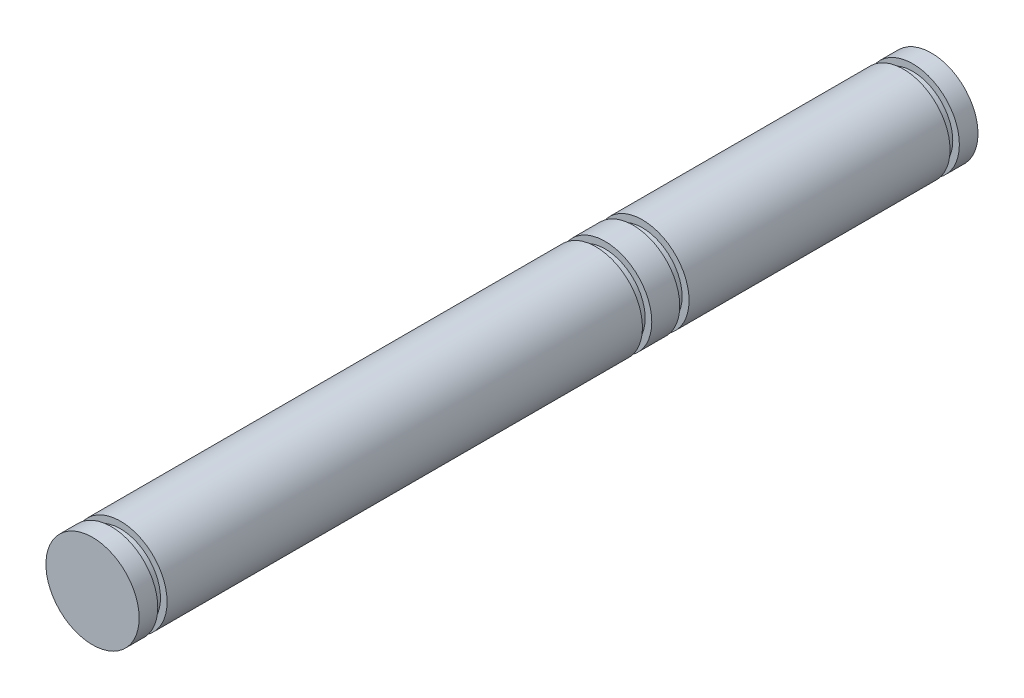
ISO-10303-21;
HEADER;
FILE_DESCRIPTION(('STEP AP214'),'2;1');
FILE_NAME('part.step','',(''),(''),'','','');
FILE_SCHEMA(('AUTOMOTIVE_DESIGN { 1 0 10303 214 1 1 1 1 }'));
ENDSEC;
DATA;
#1=APPLICATION_CONTEXT('core data for automotive mechanical design processes');
#2=APPLICATION_PROTOCOL_DEFINITION('international standard','automotive_design',2000,#1);
#3=PRODUCT_CONTEXT('',#1,'mechanical');
#4=PRODUCT('Part','Part','',(#3));
#5=PRODUCT_RELATED_PRODUCT_CATEGORY('part','',(#4));
#6=PRODUCT_DEFINITION_FORMATION('','',#4);
#7=PRODUCT_DEFINITION_CONTEXT('part definition',#1,'design');
#8=PRODUCT_DEFINITION('design','',#6,#7);
#9=PRODUCT_DEFINITION_SHAPE('','',#8);
#10=(LENGTH_UNIT() NAMED_UNIT(*) SI_UNIT(.MILLI.,.METRE.));
#11=(NAMED_UNIT(*) PLANE_ANGLE_UNIT() SI_UNIT($,.RADIAN.));
#12=(NAMED_UNIT(*) SI_UNIT($,.STERADIAN.) SOLID_ANGLE_UNIT());
#13=UNCERTAINTY_MEASURE_WITH_UNIT(LENGTH_MEASURE(1.E-05),#10,'distance_accuracy_value','');
#14=(GEOMETRIC_REPRESENTATION_CONTEXT(3) GLOBAL_UNCERTAINTY_ASSIGNED_CONTEXT((#13)) GLOBAL_UNIT_ASSIGNED_CONTEXT((#10,
#11,#12)) REPRESENTATION_CONTEXT('',''));
#15=CARTESIAN_POINT('',(0.,0.,0.));
#16=DIRECTION('',(0.,0.,1.));
#17=DIRECTION('',(1.,0.,0.));
#18=AXIS2_PLACEMENT_3D('',#15,#16,#17);
#19=CARTESIAN_POINT('',(0.,0.,7.31584543248999));
#20=DIRECTION('',(0.,0.,-1.));
#21=DIRECTION('',(-1.,0.,0.));
#22=AXIS2_PLACEMENT_3D('',#19,#20,#21);
#23=PLANE('',#22);
#24=CARTESIAN_POINT('',(0.,0.,7.31584543248999));
#25=DIRECTION('',(0.,0.,1.));
#26=DIRECTION('',(1.,0.,0.));
#27=AXIS2_PLACEMENT_3D('',#24,#25,#26);
#28=CIRCLE('',#27,5.);
#29=CARTESIAN_POINT('',(5.,0.,7.31584543248999));
#30=VERTEX_POINT('',#29);
#31=EDGE_CURVE('E10',#30,#30,#28,.T.);
#32=ORIENTED_EDGE('',*,*,#31,.T.);
#33=EDGE_LOOP('',(#32));
#34=FACE_BOUND('',#33,.T.);
#35=ADVANCED_FACE('F31',(#34),#23,.F.);
#36=CARTESIAN_POINT('',(0.,0.,7.31584543248999));
#37=DIRECTION('',(0.,0.,1.));
#38=DIRECTION('',(1.,0.,0.));
#39=AXIS2_PLACEMENT_3D('',#36,#37,#38);
#40=CYLINDRICAL_SURFACE('',#39,5.);
#41=ORIENTED_EDGE('',*,*,#31,.F.);
#42=EDGE_LOOP('',(#41));
#43=FACE_BOUND('',#42,.T.);
#44=CARTESIAN_POINT('',(0.,0.,5.31584543248999));
#45=DIRECTION('',(0.,0.,1.));
#46=DIRECTION('',(1.,0.,0.));
#47=AXIS2_PLACEMENT_3D('',#44,#45,#46);
#48=CIRCLE('',#47,5.);
#49=CARTESIAN_POINT('',(5.,0.,5.31584543248999));
#50=VERTEX_POINT('',#49);
#51=EDGE_CURVE('E37',#50,#50,#48,.T.);
#52=ORIENTED_EDGE('',*,*,#51,.T.);
#53=EDGE_LOOP('',(#52));
#54=FACE_BOUND('',#53,.T.);
#55=ADVANCED_FACE('F105',(#43,#54),#40,.T.);
#56=CARTESIAN_POINT('',(0.,5.,5.31584543248999));
#57=DIRECTION('',(0.,0.,1.));
#58=DIRECTION('',(1.,0.,0.));
#59=AXIS2_PLACEMENT_3D('',#56,#57,#58);
#60=PLANE('',#59);
#61=ORIENTED_EDGE('',*,*,#51,.F.);
#62=EDGE_LOOP('',(#61));
#63=FACE_BOUND('',#62,.T.);
#64=CARTESIAN_POINT('',(0.,0.,5.31584543248999));
#65=DIRECTION('',(0.,0.,1.));
#66=DIRECTION('',(1.,0.,0.));
#67=AXIS2_PLACEMENT_3D('',#64,#65,#66);
#68=CIRCLE('',#67,4.29203043210551);
#69=CARTESIAN_POINT('',(4.29203043210551,0.,5.31584543248999));
#70=VERTEX_POINT('',#69);
#71=EDGE_CURVE('E41',#70,#70,#68,.T.);
#72=ORIENTED_EDGE('',*,*,#71,.T.);
#73=EDGE_LOOP('',(#72));
#74=FACE_BOUND('',#73,.T.);
#75=ADVANCED_FACE('F109',(#63,#74),#60,.F.);
#76=CARTESIAN_POINT('',(0.,0.,7.31584543248999));
#77=DIRECTION('',(0.,0.,1.));
#78=DIRECTION('',(1.,0.,0.));
#79=AXIS2_PLACEMENT_3D('',#76,#77,#78);
#80=CYLINDRICAL_SURFACE('',#79,4.29203043210551);
#81=ORIENTED_EDGE('',*,*,#71,.F.);
#82=EDGE_LOOP('',(#81));
#83=FACE_BOUND('',#82,.T.);
#84=CARTESIAN_POINT('',(0.,0.,4.31584543248999));
#85=DIRECTION('',(0.,0.,1.));
#86=DIRECTION('',(1.,0.,0.));
#87=AXIS2_PLACEMENT_3D('',#84,#85,#86);
#88=CIRCLE('',#87,4.29203043210551);
#89=CARTESIAN_POINT('',(4.29203043210551,0.,4.31584543248999));
#90=VERTEX_POINT('',#89);
#91=EDGE_CURVE('E45',#90,#90,#88,.T.);
#92=ORIENTED_EDGE('',*,*,#91,.T.);
#93=EDGE_LOOP('',(#92));
#94=FACE_BOUND('',#93,.T.);
#95=ADVANCED_FACE('F114',(#83,#94),#80,.T.);
#96=CARTESIAN_POINT('',(0.,4.29203043210551,4.31584543248999));
#97=DIRECTION('',(0.,0.,-1.));
#98=DIRECTION('',(-1.,0.,0.));
#99=AXIS2_PLACEMENT_3D('',#96,#97,#98);
#100=PLANE('',#99);
#101=ORIENTED_EDGE('',*,*,#91,.F.);
#102=EDGE_LOOP('',(#101));
#103=FACE_BOUND('',#102,.T.);
#104=CARTESIAN_POINT('',(0.,0.,4.31584543248999));
#105=DIRECTION('',(0.,0.,1.));
#106=DIRECTION('',(1.,0.,0.));
#107=AXIS2_PLACEMENT_3D('',#104,#105,#106);
#108=CIRCLE('',#107,5.);
#109=CARTESIAN_POINT('',(5.,0.,4.31584543248999));
#110=VERTEX_POINT('',#109);
#111=EDGE_CURVE('E50',#110,#110,#108,.T.);
#112=ORIENTED_EDGE('',*,*,#111,.T.);
#113=EDGE_LOOP('',(#112));
#114=FACE_BOUND('',#113,.T.);
#115=ADVANCED_FACE('F120',(#103,#114),#100,.F.);
#116=CARTESIAN_POINT('',(0.,0.,7.31584543248999));
#117=DIRECTION('',(0.,0.,1.));
#118=DIRECTION('',(1.,0.,0.));
#119=AXIS2_PLACEMENT_3D('',#116,#117,#118);
#120=CYLINDRICAL_SURFACE('',#119,5.);
#121=ORIENTED_EDGE('',*,*,#111,.F.);
#122=EDGE_LOOP('',(#121));
#123=FACE_BOUND('',#122,.T.);
#124=CARTESIAN_POINT('',(0.,0.,-46.68415456751));
#125=DIRECTION('',(0.,0.,1.));
#126=DIRECTION('',(1.,0.,0.));
#127=AXIS2_PLACEMENT_3D('',#124,#125,#126);
#128=CIRCLE('',#127,5.);
#129=CARTESIAN_POINT('',(5.,0.,-46.68415456751));
#130=VERTEX_POINT('',#129);
#131=EDGE_CURVE('E53',#130,#130,#128,.T.);
#132=ORIENTED_EDGE('',*,*,#131,.T.);
#133=EDGE_LOOP('',(#132));
#134=FACE_BOUND('',#133,.T.);
#135=ADVANCED_FACE('F124',(#123,#134),#120,.T.);
#136=CARTESIAN_POINT('',(0.,5.,-46.68415456751));
#137=DIRECTION('',(0.,0.,1.));
#138=DIRECTION('',(1.,0.,0.));
#139=AXIS2_PLACEMENT_3D('',#136,#137,#138);
#140=PLANE('',#139);
#141=ORIENTED_EDGE('',*,*,#131,.F.);
#142=EDGE_LOOP('',(#141));
#143=FACE_BOUND('',#142,.T.);
#144=CARTESIAN_POINT('',(0.,0.,-46.68415456751));
#145=DIRECTION('',(0.,0.,1.));
#146=DIRECTION('',(1.,0.,0.));
#147=AXIS2_PLACEMENT_3D('',#144,#145,#146);
#148=CIRCLE('',#147,4.29203043210551);
#149=CARTESIAN_POINT('',(4.29203043210551,0.,-46.68415456751));
#150=VERTEX_POINT('',#149);
#151=EDGE_CURVE('E56',#150,#150,#148,.T.);
#152=ORIENTED_EDGE('',*,*,#151,.T.);
#153=EDGE_LOOP('',(#152));
#154=FACE_BOUND('',#153,.T.);
#155=ADVANCED_FACE('F128',(#143,#154),#140,.F.);
#156=CARTESIAN_POINT('',(0.,0.,7.31584543248999));
#157=DIRECTION('',(0.,0.,1.));
#158=DIRECTION('',(1.,0.,0.));
#159=AXIS2_PLACEMENT_3D('',#156,#157,#158);
#160=CYLINDRICAL_SURFACE('',#159,4.29203043210551);
#161=ORIENTED_EDGE('',*,*,#151,.F.);
#162=EDGE_LOOP('',(#161));
#163=FACE_BOUND('',#162,.T.);
#164=CARTESIAN_POINT('',(0.,0.,-47.68415456751));
#165=DIRECTION('',(0.,0.,1.));
#166=DIRECTION('',(1.,0.,0.));
#167=AXIS2_PLACEMENT_3D('',#164,#165,#166);
#168=CIRCLE('',#167,4.29203043210551);
#169=CARTESIAN_POINT('',(4.29203043210551,0.,-47.68415456751));
#170=VERTEX_POINT('',#169);
#171=EDGE_CURVE('E59',#170,#170,#168,.T.);
#172=ORIENTED_EDGE('',*,*,#171,.T.);
#173=EDGE_LOOP('',(#172));
#174=FACE_BOUND('',#173,.T.);
#175=ADVANCED_FACE('F132',(#163,#174),#160,.T.);
#176=CARTESIAN_POINT('',(0.,4.29203043210551,-47.68415456751));
#177=DIRECTION('',(0.,0.,-1.));
#178=DIRECTION('',(-1.,0.,0.));
#179=AXIS2_PLACEMENT_3D('',#176,#177,#178);
#180=PLANE('',#179);
#181=ORIENTED_EDGE('',*,*,#171,.F.);
#182=EDGE_LOOP('',(#181));
#183=FACE_BOUND('',#182,.T.);
#184=CARTESIAN_POINT('',(0.,0.,-47.68415456751));
#185=DIRECTION('',(0.,0.,1.));
#186=DIRECTION('',(1.,0.,0.));
#187=AXIS2_PLACEMENT_3D('',#184,#185,#186);
#188=CIRCLE('',#187,5.);
#189=CARTESIAN_POINT('',(5.,0.,-47.68415456751));
#190=VERTEX_POINT('',#189);
#191=EDGE_CURVE('E62',#190,#190,#188,.T.);
#192=ORIENTED_EDGE('',*,*,#191,.T.);
#193=EDGE_LOOP('',(#192));
#194=FACE_BOUND('',#193,.T.);
#195=ADVANCED_FACE('F136',(#183,#194),#180,.F.);
#196=CARTESIAN_POINT('',(0.,0.,7.31584543248999));
#197=DIRECTION('',(0.,0.,1.));
#198=DIRECTION('',(1.,0.,0.));
#199=AXIS2_PLACEMENT_3D('',#196,#197,#198);
#200=CYLINDRICAL_SURFACE('',#199,5.);
#201=ORIENTED_EDGE('',*,*,#191,.F.);
#202=EDGE_LOOP('',(#201));
#203=FACE_BOUND('',#202,.T.);
#204=CARTESIAN_POINT('',(0.,0.,-50.68415456751));
#205=DIRECTION('',(0.,0.,1.));
#206=DIRECTION('',(1.,0.,0.));
#207=AXIS2_PLACEMENT_3D('',#204,#205,#206);
#208=CIRCLE('',#207,5.);
#209=CARTESIAN_POINT('',(5.,0.,-50.68415456751));
#210=VERTEX_POINT('',#209);
#211=EDGE_CURVE('E65',#210,#210,#208,.T.);
#212=ORIENTED_EDGE('',*,*,#211,.T.);
#213=EDGE_LOOP('',(#212));
#214=FACE_BOUND('',#213,.T.);
#215=ADVANCED_FACE('F140',(#203,#214),#200,.T.);
#216=CARTESIAN_POINT('',(0.,5.,-50.68415456751));
#217=DIRECTION('',(0.,0.,1.));
#218=DIRECTION('',(1.,0.,0.));
#219=AXIS2_PLACEMENT_3D('',#216,#217,#218);
#220=PLANE('',#219);
#221=ORIENTED_EDGE('',*,*,#211,.F.);
#222=EDGE_LOOP('',(#221));
#223=FACE_BOUND('',#222,.T.);
#224=CARTESIAN_POINT('',(0.,0.,-50.68415456751));
#225=DIRECTION('',(0.,0.,1.));
#226=DIRECTION('',(1.,0.,0.));
#227=AXIS2_PLACEMENT_3D('',#224,#225,#226);
#228=CIRCLE('',#227,4.2558582788426);
#229=CARTESIAN_POINT('',(4.2558582788426,0.,-50.68415456751));
#230=VERTEX_POINT('',#229);
#231=EDGE_CURVE('E68',#230,#230,#228,.T.);
#232=ORIENTED_EDGE('',*,*,#231,.T.);
#233=EDGE_LOOP('',(#232));
#234=FACE_BOUND('',#233,.T.);
#235=ADVANCED_FACE('F144',(#223,#234),#220,.F.);
#236=CARTESIAN_POINT('',(0.,0.,7.31584543248999));
#237=DIRECTION('',(0.,0.,1.));
#238=DIRECTION('',(1.,0.,0.));
#239=AXIS2_PLACEMENT_3D('',#236,#237,#238);
#240=CYLINDRICAL_SURFACE('',#239,4.2558582788426);
#241=ORIENTED_EDGE('',*,*,#231,.F.);
#242=EDGE_LOOP('',(#241));
#243=FACE_BOUND('',#242,.T.);
#244=CARTESIAN_POINT('',(0.,0.,-51.68415456751));
#245=DIRECTION('',(0.,0.,1.));
#246=DIRECTION('',(1.,0.,0.));
#247=AXIS2_PLACEMENT_3D('',#244,#245,#246);
#248=CIRCLE('',#247,4.2558582788426);
#249=CARTESIAN_POINT('',(4.2558582788426,0.,-51.68415456751));
#250=VERTEX_POINT('',#249);
#251=EDGE_CURVE('E71',#250,#250,#248,.T.);
#252=ORIENTED_EDGE('',*,*,#251,.T.);
#253=EDGE_LOOP('',(#252));
#254=FACE_BOUND('',#253,.T.);
#255=ADVANCED_FACE('F148',(#243,#254),#240,.T.);
#256=CARTESIAN_POINT('',(0.,4.2558582788426,-51.68415456751));
#257=DIRECTION('',(0.,0.,-1.));
#258=DIRECTION('',(-1.,0.,0.));
#259=AXIS2_PLACEMENT_3D('',#256,#257,#258);
#260=PLANE('',#259);
#261=ORIENTED_EDGE('',*,*,#251,.F.);
#262=EDGE_LOOP('',(#261));
#263=FACE_BOUND('',#262,.T.);
#264=CARTESIAN_POINT('',(0.,0.,-51.68415456751));
#265=DIRECTION('',(0.,0.,1.));
#266=DIRECTION('',(1.,0.,0.));
#267=AXIS2_PLACEMENT_3D('',#264,#265,#266);
#268=CIRCLE('',#267,5.);
#269=CARTESIAN_POINT('',(5.,0.,-51.68415456751));
#270=VERTEX_POINT('',#269);
#271=EDGE_CURVE('E74',#270,#270,#268,.T.);
#272=ORIENTED_EDGE('',*,*,#271,.T.);
#273=EDGE_LOOP('',(#272));
#274=FACE_BOUND('',#273,.T.);
#275=ADVANCED_FACE('F152',(#263,#274),#260,.F.);
#276=CARTESIAN_POINT('',(0.,0.,7.31584543248999));
#277=DIRECTION('',(0.,0.,1.));
#278=DIRECTION('',(1.,0.,0.));
#279=AXIS2_PLACEMENT_3D('',#276,#277,#278);
#280=CYLINDRICAL_SURFACE('',#279,5.);
#281=ORIENTED_EDGE('',*,*,#271,.F.);
#282=EDGE_LOOP('',(#281));
#283=FACE_BOUND('',#282,.T.);
#284=CARTESIAN_POINT('',(0.,0.,-79.68415456751));
#285=DIRECTION('',(0.,0.,1.));
#286=DIRECTION('',(1.,0.,0.));
#287=AXIS2_PLACEMENT_3D('',#284,#285,#286);
#288=CIRCLE('',#287,5.);
#289=CARTESIAN_POINT('',(5.,0.,-79.68415456751));
#290=VERTEX_POINT('',#289);
#291=EDGE_CURVE('E77',#290,#290,#288,.T.);
#292=ORIENTED_EDGE('',*,*,#291,.T.);
#293=EDGE_LOOP('',(#292));
#294=FACE_BOUND('',#293,.T.);
#295=ADVANCED_FACE('F156',(#283,#294),#280,.T.);
#296=CARTESIAN_POINT('',(0.,5.,-79.68415456751));
#297=DIRECTION('',(0.,0.,1.));
#298=DIRECTION('',(1.,0.,0.));
#299=AXIS2_PLACEMENT_3D('',#296,#297,#298);
#300=PLANE('',#299);
#301=ORIENTED_EDGE('',*,*,#291,.F.);
#302=EDGE_LOOP('',(#301));
#303=FACE_BOUND('',#302,.T.);
#304=CARTESIAN_POINT('',(0.,0.,-79.68415456751));
#305=DIRECTION('',(0.,0.,1.));
#306=DIRECTION('',(1.,0.,0.));
#307=AXIS2_PLACEMENT_3D('',#304,#305,#306);
#308=CIRCLE('',#307,4.29203043210551);
#309=CARTESIAN_POINT('',(4.29203043210551,0.,-79.68415456751));
#310=VERTEX_POINT('',#309);
#311=EDGE_CURVE('E80',#310,#310,#308,.T.);
#312=ORIENTED_EDGE('',*,*,#311,.T.);
#313=EDGE_LOOP('',(#312));
#314=FACE_BOUND('',#313,.T.);
#315=ADVANCED_FACE('F160',(#303,#314),#300,.F.);
#316=CARTESIAN_POINT('',(0.,0.,7.31584543248999));
#317=DIRECTION('',(0.,0.,1.));
#318=DIRECTION('',(1.,0.,0.));
#319=AXIS2_PLACEMENT_3D('',#316,#317,#318);
#320=CYLINDRICAL_SURFACE('',#319,4.29203043210551);
#321=ORIENTED_EDGE('',*,*,#311,.F.);
#322=EDGE_LOOP('',(#321));
#323=FACE_BOUND('',#322,.T.);
#324=CARTESIAN_POINT('',(0.,0.,-80.68415456751));
#325=DIRECTION('',(0.,0.,1.));
#326=DIRECTION('',(1.,0.,0.));
#327=AXIS2_PLACEMENT_3D('',#324,#325,#326);
#328=CIRCLE('',#327,4.29203043210551);
#329=CARTESIAN_POINT('',(4.29203043210551,0.,-80.68415456751));
#330=VERTEX_POINT('',#329);
#331=EDGE_CURVE('E83',#330,#330,#328,.T.);
#332=ORIENTED_EDGE('',*,*,#331,.T.);
#333=EDGE_LOOP('',(#332));
#334=FACE_BOUND('',#333,.T.);
#335=ADVANCED_FACE('F164',(#323,#334),#320,.T.);
#336=CARTESIAN_POINT('',(0.,4.29203043210551,-80.68415456751));
#337=DIRECTION('',(0.,0.,-1.));
#338=DIRECTION('',(-1.,0.,0.));
#339=AXIS2_PLACEMENT_3D('',#336,#337,#338);
#340=PLANE('',#339);
#341=ORIENTED_EDGE('',*,*,#331,.F.);
#342=EDGE_LOOP('',(#341));
#343=FACE_BOUND('',#342,.T.);
#344=CARTESIAN_POINT('',(0.,0.,-80.68415456751));
#345=DIRECTION('',(0.,0.,1.));
#346=DIRECTION('',(1.,0.,0.));
#347=AXIS2_PLACEMENT_3D('',#344,#345,#346);
#348=CIRCLE('',#347,5.);
#349=CARTESIAN_POINT('',(5.,0.,-80.68415456751));
#350=VERTEX_POINT('',#349);
#351=EDGE_CURVE('E86',#350,#350,#348,.T.);
#352=ORIENTED_EDGE('',*,*,#351,.T.);
#353=EDGE_LOOP('',(#352));
#354=FACE_BOUND('',#353,.T.);
#355=ADVANCED_FACE('F101',(#343,#354),#340,.F.);
#356=CARTESIAN_POINT('',(0.,0.,7.31584543248999));
#357=DIRECTION('',(0.,0.,1.));
#358=DIRECTION('',(1.,0.,0.));
#359=AXIS2_PLACEMENT_3D('',#356,#357,#358);
#360=CYLINDRICAL_SURFACE('',#359,5.);
#361=ORIENTED_EDGE('',*,*,#351,.F.);
#362=EDGE_LOOP('',(#361));
#363=FACE_BOUND('',#362,.T.);
#364=CARTESIAN_POINT('',(0.,0.,-82.68415456751));
#365=DIRECTION('',(0.,0.,1.));
#366=DIRECTION('',(1.,0.,0.));
#367=AXIS2_PLACEMENT_3D('',#364,#365,#366);
#368=CIRCLE('',#367,5.);
#369=CARTESIAN_POINT('',(5.,0.,-82.68415456751));
#370=VERTEX_POINT('',#369);
#371=EDGE_CURVE('E89',#370,#370,#368,.T.);
#372=ORIENTED_EDGE('',*,*,#371,.T.);
#373=EDGE_LOOP('',(#372));
#374=FACE_BOUND('',#373,.T.);
#375=ADVANCED_FACE('F93',(#363,#374),#360,.T.);
#376=CARTESIAN_POINT('',(0.,5.,-82.68415456751));
#377=DIRECTION('',(0.,0.,1.));
#378=DIRECTION('',(1.,0.,0.));
#379=AXIS2_PLACEMENT_3D('',#376,#377,#378);
#380=PLANE('',#379);
#381=ORIENTED_EDGE('',*,*,#371,.F.);
#382=EDGE_LOOP('',(#381));
#383=FACE_BOUND('',#382,.T.);
#384=ADVANCED_FACE('F95',(#383),#380,.F.);
#385=CLOSED_SHELL('',(#35,#55,#75,#95,#115,#135,#155,#175,#195,#215,#235,#255,#275,#295,#315,
#335,#355,#375,#384));
#386=MANIFOLD_SOLID_BREP('B2',#385);
#387=ADVANCED_BREP_SHAPE_REPRESENTATION('',(#18,#386),#14);
#388=SHAPE_DEFINITION_REPRESENTATION(#9,#387);
ENDSEC;
END-ISO-10303-21;
